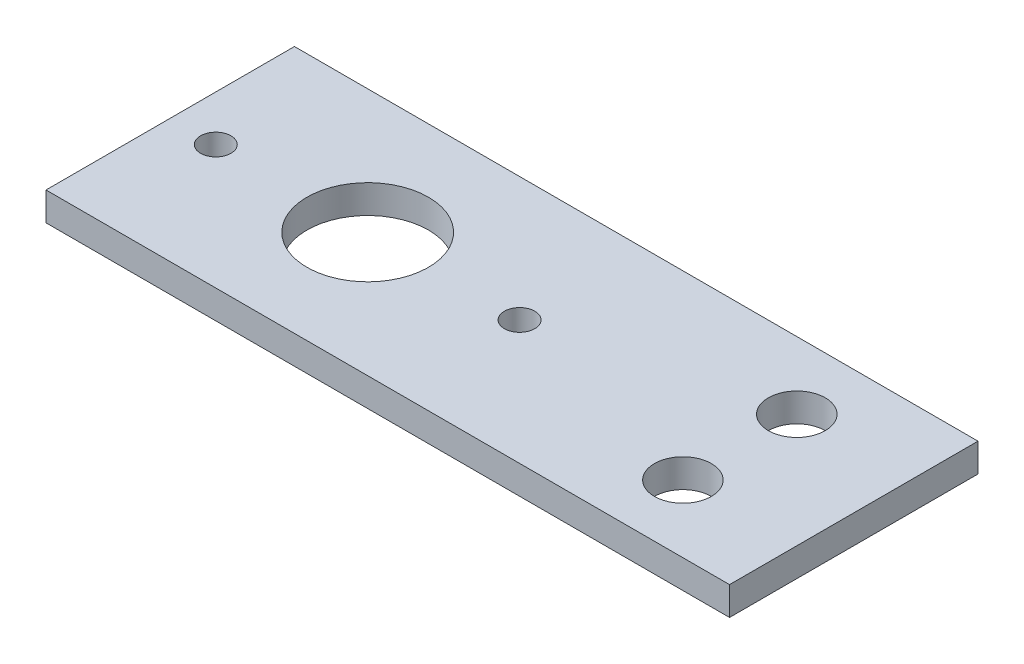
ISO-10303-21;
HEADER;
FILE_DESCRIPTION(('STEP AP214'),'2;1');
FILE_NAME('part.step','',(''),(''),'','','');
FILE_SCHEMA(('AUTOMOTIVE_DESIGN { 1 0 10303 214 1 1 1 1 }'));
ENDSEC;
DATA;
#1=APPLICATION_CONTEXT('core data for automotive mechanical design processes');
#2=APPLICATION_PROTOCOL_DEFINITION('international standard','automotive_design',2000,#1);
#3=PRODUCT_CONTEXT('',#1,'mechanical');
#4=PRODUCT('Part','Part','',(#3));
#5=PRODUCT_RELATED_PRODUCT_CATEGORY('part','',(#4));
#6=PRODUCT_DEFINITION_FORMATION('','',#4);
#7=PRODUCT_DEFINITION_CONTEXT('part definition',#1,'design');
#8=PRODUCT_DEFINITION('design','',#6,#7);
#9=PRODUCT_DEFINITION_SHAPE('','',#8);
#10=(LENGTH_UNIT() NAMED_UNIT(*) SI_UNIT(.MILLI.,.METRE.));
#11=(NAMED_UNIT(*) PLANE_ANGLE_UNIT() SI_UNIT($,.RADIAN.));
#12=(NAMED_UNIT(*) SI_UNIT($,.STERADIAN.) SOLID_ANGLE_UNIT());
#13=UNCERTAINTY_MEASURE_WITH_UNIT(LENGTH_MEASURE(1.E-05),#10,'distance_accuracy_value','');
#14=(GEOMETRIC_REPRESENTATION_CONTEXT(3) GLOBAL_UNCERTAINTY_ASSIGNED_CONTEXT((#13)) GLOBAL_UNIT_ASSIGNED_CONTEXT((#10,
#11,#12)) REPRESENTATION_CONTEXT('',''));
#15=CARTESIAN_POINT('',(0.,0.,0.));
#16=DIRECTION('',(0.,0.,1.));
#17=DIRECTION('',(1.,0.,0.));
#18=AXIS2_PLACEMENT_3D('',#15,#16,#17);
#19=CARTESIAN_POINT('',(0.,4.7625,0.));
#20=DIRECTION('',(0.,-1.,0.));
#21=DIRECTION('',(0.,0.,-1.));
#22=AXIS2_PLACEMENT_3D('',#19,#20,#21);
#23=PLANE('',#22);
#24=DIRECTION('',(0.,0.,1.));
#25=VECTOR('',#24,1.);
#26=CARTESIAN_POINT('',(-114.3,4.7625,20.7739818260166));
#27=LINE('',#26,#25);
#28=CARTESIAN_POINT('',(-114.3,4.7625,-20.7739818260166));
#29=VERTEX_POINT('',#28);
#30=CARTESIAN_POINT('',(-114.3,4.7625,20.7739818260166));
#31=VERTEX_POINT('',#30);
#32=EDGE_CURVE('E96',#29,#31,#27,.T.);
#33=ORIENTED_EDGE('',*,*,#32,.T.);
#34=DIRECTION('',(1.,0.,0.));
#35=VECTOR('',#34,1.);
#36=CARTESIAN_POINT('',(-114.3,4.7625,20.7739818260166));
#37=LINE('',#36,#35);
#38=CARTESIAN_POINT('',(0.,4.7625,20.7739818260166));
#39=VERTEX_POINT('',#38);
#40=EDGE_CURVE('E91',#31,#39,#37,.T.);
#41=ORIENTED_EDGE('',*,*,#40,.T.);
#42=DIRECTION('',(0.,0.,-1.));
#43=VECTOR('',#42,1.);
#44=CARTESIAN_POINT('',(0.,4.7625,-20.7739818260166));
#45=LINE('',#44,#43);
#46=CARTESIAN_POINT('',(0.,4.7625,-20.7739818260166));
#47=VERTEX_POINT('',#46);
#48=EDGE_CURVE('E94',#39,#47,#45,.T.);
#49=ORIENTED_EDGE('',*,*,#48,.T.);
#50=DIRECTION('',(-1.,0.,0.));
#51=VECTOR('',#50,1.);
#52=CARTESIAN_POINT('',(-114.3,4.7625,-20.7739818260166));
#53=LINE('',#52,#51);
#54=EDGE_CURVE('E61',#47,#29,#53,.T.);
#55=ORIENTED_EDGE('',*,*,#54,.T.);
#56=EDGE_LOOP('',(#33,#41,#49,#55));
#57=FACE_BOUND('',#56,.T.);
#58=CARTESIAN_POINT('',(-106.68,4.7625,0.));
#59=DIRECTION('',(0.,1.,0.));
#60=DIRECTION('',(0.,0.,1.));
#61=AXIS2_PLACEMENT_3D('',#58,#59,#60);
#62=CIRCLE('',#61,2.53999999999998);
#63=CARTESIAN_POINT('',(-106.68,4.7625,-2.53999999999998));
#64=VERTEX_POINT('',#63);
#65=EDGE_CURVE('E116',#64,#64,#62,.T.);
#66=ORIENTED_EDGE('',*,*,#65,.F.);
#67=EDGE_LOOP('',(#66));
#68=FACE_BOUND('',#67,.T.);
#69=CARTESIAN_POINT('',(-81.28,4.7625,0.));
#70=DIRECTION('',(0.,1.,0.));
#71=DIRECTION('',(0.,0.,1.));
#72=AXIS2_PLACEMENT_3D('',#69,#70,#71);
#73=CIRCLE('',#72,10.16);
#74=CARTESIAN_POINT('',(-81.28,4.7625,-10.16));
#75=VERTEX_POINT('',#74);
#76=EDGE_CURVE('E138',#75,#75,#73,.T.);
#77=ORIENTED_EDGE('',*,*,#76,.F.);
#78=EDGE_LOOP('',(#77));
#79=FACE_BOUND('',#78,.T.);
#80=CARTESIAN_POINT('',(-55.88,4.7625,0.));
#81=DIRECTION('',(0.,1.,0.));
#82=DIRECTION('',(0.,0.,1.));
#83=AXIS2_PLACEMENT_3D('',#80,#81,#82);
#84=CIRCLE('',#83,2.53999999999998);
#85=CARTESIAN_POINT('',(-55.88,4.7625,-2.53999999999998));
#86=VERTEX_POINT('',#85);
#87=EDGE_CURVE('E146',#86,#86,#84,.T.);
#88=ORIENTED_EDGE('',*,*,#87,.F.);
#89=EDGE_LOOP('',(#88));
#90=FACE_BOUND('',#89,.T.);
#91=CARTESIAN_POINT('',(-19.05,4.7625,-9.525));
#92=DIRECTION('',(0.,1.,0.));
#93=DIRECTION('',(0.,0.,1.));
#94=AXIS2_PLACEMENT_3D('',#91,#92,#93);
#95=CIRCLE('',#94,4.7625);
#96=CARTESIAN_POINT('',(-19.05,4.7625,-14.2875));
#97=VERTEX_POINT('',#96);
#98=EDGE_CURVE('E154',#97,#97,#95,.T.);
#99=ORIENTED_EDGE('',*,*,#98,.F.);
#100=EDGE_LOOP('',(#99));
#101=FACE_BOUND('',#100,.T.);
#102=CARTESIAN_POINT('',(-19.05,4.7625,9.525));
#103=DIRECTION('',(0.,1.,0.));
#104=DIRECTION('',(0.,0.,-1.));
#105=AXIS2_PLACEMENT_3D('',#102,#103,#104);
#106=CIRCLE('',#105,4.7625);
#107=CARTESIAN_POINT('',(-19.05,4.7625,4.7625));
#108=VERTEX_POINT('',#107);
#109=EDGE_CURVE('E162',#108,#108,#106,.T.);
#110=ORIENTED_EDGE('',*,*,#109,.F.);
#111=EDGE_LOOP('',(#110));
#112=FACE_BOUND('',#111,.T.);
#113=ADVANCED_FACE('F43',(#57,#68,#79,#90,#101,#112),#23,.F.);
#114=CARTESIAN_POINT('',(0.,0.,0.));
#115=DIRECTION('',(0.,-1.,0.));
#116=DIRECTION('',(0.,0.,-1.));
#117=AXIS2_PLACEMENT_3D('',#114,#115,#116);
#118=PLANE('',#117);
#119=CARTESIAN_POINT('',(-19.05,0.,-9.525));
#120=DIRECTION('',(0.,1.,0.));
#121=DIRECTION('',(0.,0.,1.));
#122=AXIS2_PLACEMENT_3D('',#119,#120,#121);
#123=CIRCLE('',#122,4.7625);
#124=CARTESIAN_POINT('',(-19.05,0.,-14.2875));
#125=VERTEX_POINT('',#124);
#126=EDGE_CURVE('E158',#125,#125,#123,.T.);
#127=ORIENTED_EDGE('',*,*,#126,.T.);
#128=EDGE_LOOP('',(#127));
#129=FACE_BOUND('',#128,.T.);
#130=CARTESIAN_POINT('',(-81.28,0.,0.));
#131=DIRECTION('',(0.,1.,0.));
#132=DIRECTION('',(0.,0.,1.));
#133=AXIS2_PLACEMENT_3D('',#130,#131,#132);
#134=CIRCLE('',#133,10.16);
#135=CARTESIAN_POINT('',(-81.28,0.,-10.16));
#136=VERTEX_POINT('',#135);
#137=EDGE_CURVE('E142',#136,#136,#134,.T.);
#138=ORIENTED_EDGE('',*,*,#137,.T.);
#139=EDGE_LOOP('',(#138));
#140=FACE_BOUND('',#139,.T.);
#141=DIRECTION('',(0.,0.,1.));
#142=VECTOR('',#141,1.);
#143=CARTESIAN_POINT('',(-114.3,0.,20.7739818260166));
#144=LINE('',#143,#142);
#145=CARTESIAN_POINT('',(-114.3,0.,-20.7739818260166));
#146=VERTEX_POINT('',#145);
#147=CARTESIAN_POINT('',(-114.3,0.,20.7739818260166));
#148=VERTEX_POINT('',#147);
#149=EDGE_CURVE('E112',#146,#148,#144,.T.);
#150=ORIENTED_EDGE('',*,*,#149,.F.);
#151=DIRECTION('',(-1.,0.,0.));
#152=VECTOR('',#151,1.);
#153=CARTESIAN_POINT('',(-114.3,0.,-20.7739818260166));
#154=LINE('',#153,#152);
#155=CARTESIAN_POINT('',(0.,0.,-20.7739818260166));
#156=VERTEX_POINT('',#155);
#157=EDGE_CURVE('E84',#156,#146,#154,.T.);
#158=ORIENTED_EDGE('',*,*,#157,.F.);
#159=DIRECTION('',(0.,0.,-1.));
#160=VECTOR('',#159,1.);
#161=CARTESIAN_POINT('',(0.,0.,-20.7739818260166));
#162=LINE('',#161,#160);
#163=CARTESIAN_POINT('',(0.,0.,20.7739818260166));
#164=VERTEX_POINT('',#163);
#165=EDGE_CURVE('E78',#164,#156,#162,.T.);
#166=ORIENTED_EDGE('',*,*,#165,.F.);
#167=DIRECTION('',(1.,0.,0.));
#168=VECTOR('',#167,1.);
#169=CARTESIAN_POINT('',(-114.3,0.,20.7739818260166));
#170=LINE('',#169,#168);
#171=EDGE_CURVE('E101',#148,#164,#170,.T.);
#172=ORIENTED_EDGE('',*,*,#171,.F.);
#173=EDGE_LOOP('',(#150,#158,#166,#172));
#174=FACE_BOUND('',#173,.T.);
#175=CARTESIAN_POINT('',(-106.68,0.,0.));
#176=DIRECTION('',(0.,1.,0.));
#177=DIRECTION('',(0.,0.,1.));
#178=AXIS2_PLACEMENT_3D('',#175,#176,#177);
#179=CIRCLE('',#178,2.53999999999998);
#180=CARTESIAN_POINT('',(-106.68,0.,-2.53999999999998));
#181=VERTEX_POINT('',#180);
#182=EDGE_CURVE('E134',#181,#181,#179,.T.);
#183=ORIENTED_EDGE('',*,*,#182,.T.);
#184=EDGE_LOOP('',(#183));
#185=FACE_BOUND('',#184,.T.);
#186=CARTESIAN_POINT('',(-55.88,0.,0.));
#187=DIRECTION('',(0.,1.,0.));
#188=DIRECTION('',(0.,0.,1.));
#189=AXIS2_PLACEMENT_3D('',#186,#187,#188);
#190=CIRCLE('',#189,2.53999999999998);
#191=CARTESIAN_POINT('',(-55.88,0.,-2.53999999999998));
#192=VERTEX_POINT('',#191);
#193=EDGE_CURVE('E150',#192,#192,#190,.T.);
#194=ORIENTED_EDGE('',*,*,#193,.T.);
#195=EDGE_LOOP('',(#194));
#196=FACE_BOUND('',#195,.T.);
#197=CARTESIAN_POINT('',(-19.05,0.,9.525));
#198=DIRECTION('',(0.,1.,0.));
#199=DIRECTION('',(0.,0.,-1.));
#200=AXIS2_PLACEMENT_3D('',#197,#198,#199);
#201=CIRCLE('',#200,4.7625);
#202=CARTESIAN_POINT('',(-19.05,0.,4.7625));
#203=VERTEX_POINT('',#202);
#204=EDGE_CURVE('E166',#203,#203,#201,.T.);
#205=ORIENTED_EDGE('',*,*,#204,.T.);
#206=EDGE_LOOP('',(#205));
#207=FACE_BOUND('',#206,.T.);
#208=ADVANCED_FACE('F129',(#129,#140,#174,#185,#196,#207),#118,.T.);
#209=CARTESIAN_POINT('',(-114.3,4.7625,20.7739818260166));
#210=DIRECTION('',(1.,0.,0.));
#211=DIRECTION('',(0.,0.,-1.));
#212=AXIS2_PLACEMENT_3D('',#209,#210,#211);
#213=PLANE('',#212);
#214=ORIENTED_EDGE('',*,*,#149,.T.);
#215=DIRECTION('',(0.,-1.,0.));
#216=VECTOR('',#215,1.);
#217=CARTESIAN_POINT('',(-114.3,4.7625,20.7739818260166));
#218=LINE('',#217,#216);
#219=EDGE_CURVE('E11',#31,#148,#218,.T.);
#220=ORIENTED_EDGE('',*,*,#219,.F.);
#221=ORIENTED_EDGE('',*,*,#32,.F.);
#222=DIRECTION('',(0.,-1.,0.));
#223=VECTOR('',#222,1.);
#224=CARTESIAN_POINT('',(-114.3,4.7625,-20.7739818260166));
#225=LINE('',#224,#223);
#226=EDGE_CURVE('E108',#29,#146,#225,.T.);
#227=ORIENTED_EDGE('',*,*,#226,.T.);
#228=EDGE_LOOP('',(#214,#220,#221,#227));
#229=FACE_BOUND('',#228,.T.);
#230=ADVANCED_FACE('F45',(#229),#213,.F.);
#231=CARTESIAN_POINT('',(-114.3,4.7625,20.7739818260166));
#232=DIRECTION('',(0.,0.,-1.));
#233=DIRECTION('',(-1.,0.,0.));
#234=AXIS2_PLACEMENT_3D('',#231,#232,#233);
#235=PLANE('',#234);
#236=ORIENTED_EDGE('',*,*,#171,.T.);
#237=DIRECTION('',(0.,-1.,0.));
#238=VECTOR('',#237,1.);
#239=CARTESIAN_POINT('',(0.,4.7625,20.7739818260166));
#240=LINE('',#239,#238);
#241=EDGE_CURVE('E53',#39,#164,#240,.T.);
#242=ORIENTED_EDGE('',*,*,#241,.F.);
#243=ORIENTED_EDGE('',*,*,#40,.F.);
#244=ORIENTED_EDGE('',*,*,#219,.T.);
#245=EDGE_LOOP('',(#236,#242,#243,#244));
#246=FACE_BOUND('',#245,.T.);
#247=ADVANCED_FACE('F100',(#246),#235,.F.);
#248=CARTESIAN_POINT('',(0.,4.7625,-20.7739818260166));
#249=DIRECTION('',(-1.,0.,0.));
#250=DIRECTION('',(0.,0.,1.));
#251=AXIS2_PLACEMENT_3D('',#248,#249,#250);
#252=PLANE('',#251);
#253=ORIENTED_EDGE('',*,*,#165,.T.);
#254=DIRECTION('',(0.,-1.,0.));
#255=VECTOR('',#254,1.);
#256=CARTESIAN_POINT('',(0.,4.7625,-20.7739818260166));
#257=LINE('',#256,#255);
#258=EDGE_CURVE('E103',#47,#156,#257,.T.);
#259=ORIENTED_EDGE('',*,*,#258,.F.);
#260=ORIENTED_EDGE('',*,*,#48,.F.);
#261=ORIENTED_EDGE('',*,*,#241,.T.);
#262=EDGE_LOOP('',(#253,#259,#260,#261));
#263=FACE_BOUND('',#262,.T.);
#264=ADVANCED_FACE('F104',(#263),#252,.F.);
#265=CARTESIAN_POINT('',(-114.3,4.7625,-20.7739818260166));
#266=DIRECTION('',(0.,0.,1.));
#267=DIRECTION('',(1.,0.,0.));
#268=AXIS2_PLACEMENT_3D('',#265,#266,#267);
#269=PLANE('',#268);
#270=ORIENTED_EDGE('',*,*,#157,.T.);
#271=ORIENTED_EDGE('',*,*,#226,.F.);
#272=ORIENTED_EDGE('',*,*,#54,.F.);
#273=ORIENTED_EDGE('',*,*,#258,.T.);
#274=EDGE_LOOP('',(#270,#271,#272,#273));
#275=FACE_BOUND('',#274,.T.);
#276=ADVANCED_FACE('F126',(#275),#269,.F.);
#277=CARTESIAN_POINT('',(-106.68,4.7625,0.));
#278=DIRECTION('',(0.,-1.,0.));
#279=DIRECTION('',(0.,0.,-1.));
#280=AXIS2_PLACEMENT_3D('',#277,#278,#279);
#281=CYLINDRICAL_SURFACE('',#280,2.53999999999998);
#282=CARTESIAN_POINT('',(-106.68,4.7625,-2.53999999999998));
#283=CARTESIAN_POINT('',(-106.68,4.712890625,-2.53999999999998));
#284=CARTESIAN_POINT('',(-106.68,4.66328125,-2.53999999999998));
#285=CARTESIAN_POINT('',(-106.68,4.5640625,-2.53999999999998));
#286=CARTESIAN_POINT('',(-106.68,4.514453125,-2.53999999999998));
#287=CARTESIAN_POINT('',(-106.68,4.415234375,-2.53999999999998));
#288=CARTESIAN_POINT('',(-106.68,4.365625,-2.53999999999998));
#289=CARTESIAN_POINT('',(-106.68,4.26640625,-2.53999999999998));
#290=CARTESIAN_POINT('',(-106.68,4.216796875,-2.53999999999998));
#291=CARTESIAN_POINT('',(-106.68,4.117578125,-2.53999999999998));
#292=CARTESIAN_POINT('',(-106.68,4.06796875,-2.53999999999998));
#293=CARTESIAN_POINT('',(-106.68,3.96875,-2.53999999999998));
#294=CARTESIAN_POINT('',(-106.68,3.919140625,-2.53999999999998));
#295=CARTESIAN_POINT('',(-106.68,3.819921875,-2.53999999999998));
#296=CARTESIAN_POINT('',(-106.68,3.7703125,-2.53999999999998));
#297=CARTESIAN_POINT('',(-106.68,3.67109375,-2.53999999999998));
#298=CARTESIAN_POINT('',(-106.68,3.621484375,-2.53999999999998));
#299=CARTESIAN_POINT('',(-106.68,3.522265625,-2.53999999999998));
#300=CARTESIAN_POINT('',(-106.68,3.47265625,-2.53999999999998));
#301=CARTESIAN_POINT('',(-106.68,3.3734375,-2.53999999999998));
#302=CARTESIAN_POINT('',(-106.68,3.323828125,-2.53999999999998));
#303=CARTESIAN_POINT('',(-106.68,3.224609375,-2.53999999999998));
#304=CARTESIAN_POINT('',(-106.68,3.175,-2.53999999999998));
#305=CARTESIAN_POINT('',(-106.68,3.07578125,-2.53999999999998));
#306=CARTESIAN_POINT('',(-106.68,3.026171875,-2.53999999999998));
#307=CARTESIAN_POINT('',(-106.68,2.926953125,-2.53999999999998));
#308=CARTESIAN_POINT('',(-106.68,2.87734375,-2.53999999999998));
#309=CARTESIAN_POINT('',(-106.68,2.778125,-2.53999999999998));
#310=CARTESIAN_POINT('',(-106.68,2.728515625,-2.53999999999998));
#311=CARTESIAN_POINT('',(-106.68,2.629296875,-2.53999999999998));
#312=CARTESIAN_POINT('',(-106.68,2.5796875,-2.53999999999998));
#313=CARTESIAN_POINT('',(-106.68,2.48046875,-2.53999999999998));
#314=CARTESIAN_POINT('',(-106.68,2.430859375,-2.53999999999998));
#315=CARTESIAN_POINT('',(-106.68,2.331640625,-2.53999999999998));
#316=CARTESIAN_POINT('',(-106.68,2.28203125,-2.53999999999998));
#317=CARTESIAN_POINT('',(-106.68,2.1828125,-2.53999999999998));
#318=CARTESIAN_POINT('',(-106.68,2.133203125,-2.53999999999998));
#319=CARTESIAN_POINT('',(-106.68,2.033984375,-2.53999999999998));
#320=CARTESIAN_POINT('',(-106.68,1.984375,-2.53999999999998));
#321=CARTESIAN_POINT('',(-106.68,1.88515625,-2.53999999999998));
#322=CARTESIAN_POINT('',(-106.68,1.835546875,-2.53999999999998));
#323=CARTESIAN_POINT('',(-106.68,1.736328125,-2.53999999999998));
#324=CARTESIAN_POINT('',(-106.68,1.68671875,-2.53999999999998));
#325=CARTESIAN_POINT('',(-106.68,1.5875,-2.53999999999998));
#326=CARTESIAN_POINT('',(-106.68,1.537890625,-2.53999999999998));
#327=CARTESIAN_POINT('',(-106.68,1.438671875,-2.53999999999998));
#328=CARTESIAN_POINT('',(-106.68,1.3890625,-2.53999999999998));
#329=CARTESIAN_POINT('',(-106.68,1.28984375,-2.53999999999998));
#330=CARTESIAN_POINT('',(-106.68,1.240234375,-2.53999999999998));
#331=CARTESIAN_POINT('',(-106.68,1.141015625,-2.53999999999998));
#332=CARTESIAN_POINT('',(-106.68,1.09140625,-2.53999999999998));
#333=CARTESIAN_POINT('',(-106.68,0.992187499999999,-2.53999999999998));
#334=CARTESIAN_POINT('',(-106.68,0.942578124999999,-2.53999999999998));
#335=CARTESIAN_POINT('',(-106.68,0.843359375,-2.53999999999998));
#336=CARTESIAN_POINT('',(-106.68,0.79375,-2.53999999999998));
#337=CARTESIAN_POINT('',(-106.68,0.69453125,-2.53999999999998));
#338=CARTESIAN_POINT('',(-106.68,0.644921875,-2.53999999999998));
#339=CARTESIAN_POINT('',(-106.68,0.545703125,-2.53999999999998));
#340=CARTESIAN_POINT('',(-106.68,0.49609375,-2.53999999999998));
#341=CARTESIAN_POINT('',(-106.68,0.396875,-2.53999999999998));
#342=CARTESIAN_POINT('',(-106.68,0.347265625,-2.53999999999998));
#343=CARTESIAN_POINT('',(-106.68,0.248046875,-2.53999999999998));
#344=CARTESIAN_POINT('',(-106.68,0.1984375,-2.53999999999998));
#345=CARTESIAN_POINT('',(-106.68,0.09921875,-2.53999999999998));
#346=CARTESIAN_POINT('',(-106.68,0.049609375,-2.53999999999998));
#347=CARTESIAN_POINT('',(-106.68,0.,-2.53999999999998));
#348=B_SPLINE_CURVE_WITH_KNOTS('',3,(#282,#283,#284,#285,#286,#287,#288,#289,#290,#291,#292,
#293,#294,#295,#296,#297,#298,#299,#300,#301,#302,#303,#304,#305,#306,#307,#308,#309,#310,#311,
#312,#313,#314,#315,#316,#317,#318,#319,#320,#321,#322,#323,#324,#325,#326,#327,#328,#329,#330,
#331,#332,#333,#334,#335,#336,#337,#338,#339,#340,#341,#342,#343,#344,#345,#346,#347),
.UNSPECIFIED.,.F.,.F.,(4,2,2,2,2,2,2,2,2,2,2,2,2,2,2,2,2,2,2,2,2,2,2,2,2,2,2,2,2,2,2,2,4),(0.,
0.148828125,0.29765625,0.446484375,0.5953125,0.744140625,0.892968750000001,1.041796875,1.190625,
1.339453125,1.48828125,1.637109375,1.7859375,1.934765625,2.08359375,2.232421875,2.38125,
2.530078125,2.67890625,2.827734375,2.9765625,3.125390625,3.27421875,3.423046875,3.571875,
3.720703125,3.86953125,4.018359375,4.1671875,4.316015625,4.46484375,4.613671875,4.7625),.UNSPECIFIED.);
#349=EDGE_CURVE('BSEAM185',#64,#181,#348,.T.);
#350=ORIENTED_EDGE('',*,*,#65,.T.);
#351=ORIENTED_EDGE('',*,*,#182,.F.);
#352=ORIENTED_EDGE('',*,*,#349,.T.);
#353=ORIENTED_EDGE('',*,*,#349,.F.);
#354=EDGE_LOOP('',(#350,#352,#351,#353));
#355=FACE_BOUND('',#354,.T.);
#356=ADVANCED_FACE('F185',(#355),#281,.F.);
#357=CARTESIAN_POINT('',(-81.28,4.7625,0.));
#358=DIRECTION('',(0.,-1.,0.));
#359=DIRECTION('',(0.,0.,-1.));
#360=AXIS2_PLACEMENT_3D('',#357,#358,#359);
#361=CYLINDRICAL_SURFACE('',#360,10.16);
#362=CARTESIAN_POINT('',(-81.28,4.7625,-10.16));
#363=CARTESIAN_POINT('',(-81.28,4.712890625,-10.16));
#364=CARTESIAN_POINT('',(-81.28,4.66328125,-10.16));
#365=CARTESIAN_POINT('',(-81.28,4.5640625,-10.16));
#366=CARTESIAN_POINT('',(-81.28,4.514453125,-10.16));
#367=CARTESIAN_POINT('',(-81.28,4.415234375,-10.16));
#368=CARTESIAN_POINT('',(-81.28,4.365625,-10.16));
#369=CARTESIAN_POINT('',(-81.28,4.26640625,-10.16));
#370=CARTESIAN_POINT('',(-81.28,4.216796875,-10.16));
#371=CARTESIAN_POINT('',(-81.28,4.117578125,-10.16));
#372=CARTESIAN_POINT('',(-81.28,4.06796875,-10.16));
#373=CARTESIAN_POINT('',(-81.28,3.96875,-10.16));
#374=CARTESIAN_POINT('',(-81.28,3.919140625,-10.16));
#375=CARTESIAN_POINT('',(-81.28,3.819921875,-10.16));
#376=CARTESIAN_POINT('',(-81.28,3.7703125,-10.16));
#377=CARTESIAN_POINT('',(-81.28,3.67109375,-10.16));
#378=CARTESIAN_POINT('',(-81.28,3.621484375,-10.16));
#379=CARTESIAN_POINT('',(-81.28,3.522265625,-10.16));
#380=CARTESIAN_POINT('',(-81.28,3.47265625,-10.16));
#381=CARTESIAN_POINT('',(-81.28,3.3734375,-10.16));
#382=CARTESIAN_POINT('',(-81.28,3.323828125,-10.16));
#383=CARTESIAN_POINT('',(-81.28,3.224609375,-10.16));
#384=CARTESIAN_POINT('',(-81.28,3.175,-10.16));
#385=CARTESIAN_POINT('',(-81.28,3.07578125,-10.16));
#386=CARTESIAN_POINT('',(-81.28,3.026171875,-10.16));
#387=CARTESIAN_POINT('',(-81.28,2.926953125,-10.16));
#388=CARTESIAN_POINT('',(-81.28,2.87734375,-10.16));
#389=CARTESIAN_POINT('',(-81.28,2.778125,-10.16));
#390=CARTESIAN_POINT('',(-81.28,2.728515625,-10.16));
#391=CARTESIAN_POINT('',(-81.28,2.629296875,-10.16));
#392=CARTESIAN_POINT('',(-81.28,2.5796875,-10.16));
#393=CARTESIAN_POINT('',(-81.28,2.48046875,-10.16));
#394=CARTESIAN_POINT('',(-81.28,2.430859375,-10.16));
#395=CARTESIAN_POINT('',(-81.28,2.331640625,-10.16));
#396=CARTESIAN_POINT('',(-81.28,2.28203125,-10.16));
#397=CARTESIAN_POINT('',(-81.28,2.1828125,-10.16));
#398=CARTESIAN_POINT('',(-81.28,2.133203125,-10.16));
#399=CARTESIAN_POINT('',(-81.28,2.033984375,-10.16));
#400=CARTESIAN_POINT('',(-81.28,1.984375,-10.16));
#401=CARTESIAN_POINT('',(-81.28,1.88515625,-10.16));
#402=CARTESIAN_POINT('',(-81.28,1.835546875,-10.16));
#403=CARTESIAN_POINT('',(-81.28,1.736328125,-10.16));
#404=CARTESIAN_POINT('',(-81.28,1.68671875,-10.16));
#405=CARTESIAN_POINT('',(-81.28,1.5875,-10.16));
#406=CARTESIAN_POINT('',(-81.28,1.537890625,-10.16));
#407=CARTESIAN_POINT('',(-81.28,1.438671875,-10.16));
#408=CARTESIAN_POINT('',(-81.28,1.3890625,-10.16));
#409=CARTESIAN_POINT('',(-81.28,1.28984375,-10.16));
#410=CARTESIAN_POINT('',(-81.28,1.240234375,-10.16));
#411=CARTESIAN_POINT('',(-81.28,1.141015625,-10.16));
#412=CARTESIAN_POINT('',(-81.28,1.09140625,-10.16));
#413=CARTESIAN_POINT('',(-81.28,0.9921875,-10.16));
#414=CARTESIAN_POINT('',(-81.28,0.942578125,-10.16));
#415=CARTESIAN_POINT('',(-81.28,0.843359375,-10.16));
#416=CARTESIAN_POINT('',(-81.28,0.79375,-10.16));
#417=CARTESIAN_POINT('',(-81.28,0.69453125,-10.16));
#418=CARTESIAN_POINT('',(-81.28,0.644921875,-10.16));
#419=CARTESIAN_POINT('',(-81.28,0.545703125,-10.16));
#420=CARTESIAN_POINT('',(-81.28,0.49609375,-10.16));
#421=CARTESIAN_POINT('',(-81.28,0.396875,-10.16));
#422=CARTESIAN_POINT('',(-81.28,0.347265625,-10.16));
#423=CARTESIAN_POINT('',(-81.28,0.248046875,-10.16));
#424=CARTESIAN_POINT('',(-81.28,0.1984375,-10.16));
#425=CARTESIAN_POINT('',(-81.28,0.09921875,-10.16));
#426=CARTESIAN_POINT('',(-81.28,0.049609375,-10.16));
#427=CARTESIAN_POINT('',(-81.28,0.,-10.16));
#428=B_SPLINE_CURVE_WITH_KNOTS('',3,(#362,#363,#364,#365,#366,#367,#368,#369,#370,#371,#372,
#373,#374,#375,#376,#377,#378,#379,#380,#381,#382,#383,#384,#385,#386,#387,#388,#389,#390,#391,
#392,#393,#394,#395,#396,#397,#398,#399,#400,#401,#402,#403,#404,#405,#406,#407,#408,#409,#410,
#411,#412,#413,#414,#415,#416,#417,#418,#419,#420,#421,#422,#423,#424,#425,#426,#427),
.UNSPECIFIED.,.F.,.F.,(4,2,2,2,2,2,2,2,2,2,2,2,2,2,2,2,2,2,2,2,2,2,2,2,2,2,2,2,2,2,2,2,4),(0.,
0.148828124999999,0.297656249999999,0.446484374999999,0.595312499999999,0.744140625,0.89296875,
1.041796875,1.190625,1.339453125,1.48828125,1.637109375,1.7859375,1.934765625,2.08359375,
2.232421875,2.38125,2.530078125,2.67890625,2.827734375,2.9765625,3.125390625,3.27421875,
3.423046875,3.571875,3.720703125,3.86953125,4.018359375,4.1671875,4.316015625,4.46484375,
4.613671875,4.7625),.UNSPECIFIED.);
#429=EDGE_CURVE('BSEAM239',#75,#136,#428,.T.);
#430=ORIENTED_EDGE('',*,*,#76,.T.);
#431=ORIENTED_EDGE('',*,*,#137,.F.);
#432=ORIENTED_EDGE('',*,*,#429,.T.);
#433=ORIENTED_EDGE('',*,*,#429,.F.);
#434=EDGE_LOOP('',(#430,#432,#431,#433));
#435=FACE_BOUND('',#434,.T.);
#436=ADVANCED_FACE('F239',(#435),#361,.F.);
#437=CARTESIAN_POINT('',(-55.88,4.7625,0.));
#438=DIRECTION('',(0.,-1.,0.));
#439=DIRECTION('',(0.,0.,-1.));
#440=AXIS2_PLACEMENT_3D('',#437,#438,#439);
#441=CYLINDRICAL_SURFACE('',#440,2.53999999999998);
#442=CARTESIAN_POINT('',(-55.88,4.7625,-2.53999999999998));
#443=CARTESIAN_POINT('',(-55.88,4.712890625,-2.53999999999998));
#444=CARTESIAN_POINT('',(-55.88,4.66328125,-2.53999999999998));
#445=CARTESIAN_POINT('',(-55.88,4.5640625,-2.53999999999998));
#446=CARTESIAN_POINT('',(-55.88,4.514453125,-2.53999999999998));
#447=CARTESIAN_POINT('',(-55.88,4.415234375,-2.53999999999998));
#448=CARTESIAN_POINT('',(-55.88,4.365625,-2.53999999999998));
#449=CARTESIAN_POINT('',(-55.88,4.26640625,-2.53999999999998));
#450=CARTESIAN_POINT('',(-55.88,4.216796875,-2.53999999999998));
#451=CARTESIAN_POINT('',(-55.88,4.117578125,-2.53999999999998));
#452=CARTESIAN_POINT('',(-55.88,4.06796875,-2.53999999999998));
#453=CARTESIAN_POINT('',(-55.88,3.96875,-2.53999999999998));
#454=CARTESIAN_POINT('',(-55.88,3.919140625,-2.53999999999998));
#455=CARTESIAN_POINT('',(-55.88,3.819921875,-2.53999999999998));
#456=CARTESIAN_POINT('',(-55.88,3.7703125,-2.53999999999998));
#457=CARTESIAN_POINT('',(-55.88,3.67109375,-2.53999999999998));
#458=CARTESIAN_POINT('',(-55.88,3.621484375,-2.53999999999998));
#459=CARTESIAN_POINT('',(-55.88,3.522265625,-2.53999999999998));
#460=CARTESIAN_POINT('',(-55.88,3.47265625,-2.53999999999998));
#461=CARTESIAN_POINT('',(-55.88,3.3734375,-2.53999999999998));
#462=CARTESIAN_POINT('',(-55.88,3.323828125,-2.53999999999998));
#463=CARTESIAN_POINT('',(-55.88,3.224609375,-2.53999999999998));
#464=CARTESIAN_POINT('',(-55.88,3.175,-2.53999999999998));
#465=CARTESIAN_POINT('',(-55.88,3.07578125,-2.53999999999998));
#466=CARTESIAN_POINT('',(-55.88,3.026171875,-2.53999999999998));
#467=CARTESIAN_POINT('',(-55.88,2.926953125,-2.53999999999998));
#468=CARTESIAN_POINT('',(-55.88,2.87734375,-2.53999999999998));
#469=CARTESIAN_POINT('',(-55.88,2.778125,-2.53999999999998));
#470=CARTESIAN_POINT('',(-55.88,2.728515625,-2.53999999999998));
#471=CARTESIAN_POINT('',(-55.88,2.629296875,-2.53999999999998));
#472=CARTESIAN_POINT('',(-55.88,2.5796875,-2.53999999999998));
#473=CARTESIAN_POINT('',(-55.88,2.48046875,-2.53999999999998));
#474=CARTESIAN_POINT('',(-55.88,2.430859375,-2.53999999999998));
#475=CARTESIAN_POINT('',(-55.88,2.331640625,-2.53999999999998));
#476=CARTESIAN_POINT('',(-55.88,2.28203125,-2.53999999999998));
#477=CARTESIAN_POINT('',(-55.88,2.1828125,-2.53999999999998));
#478=CARTESIAN_POINT('',(-55.88,2.133203125,-2.53999999999998));
#479=CARTESIAN_POINT('',(-55.88,2.033984375,-2.53999999999998));
#480=CARTESIAN_POINT('',(-55.88,1.984375,-2.53999999999998));
#481=CARTESIAN_POINT('',(-55.88,1.88515625,-2.53999999999998));
#482=CARTESIAN_POINT('',(-55.88,1.835546875,-2.53999999999998));
#483=CARTESIAN_POINT('',(-55.88,1.736328125,-2.53999999999998));
#484=CARTESIAN_POINT('',(-55.88,1.68671875,-2.53999999999998));
#485=CARTESIAN_POINT('',(-55.88,1.5875,-2.53999999999998));
#486=CARTESIAN_POINT('',(-55.88,1.537890625,-2.53999999999998));
#487=CARTESIAN_POINT('',(-55.88,1.438671875,-2.53999999999998));
#488=CARTESIAN_POINT('',(-55.88,1.3890625,-2.53999999999998));
#489=CARTESIAN_POINT('',(-55.88,1.28984375,-2.53999999999998));
#490=CARTESIAN_POINT('',(-55.88,1.240234375,-2.53999999999998));
#491=CARTESIAN_POINT('',(-55.88,1.141015625,-2.53999999999998));
#492=CARTESIAN_POINT('',(-55.88,1.09140625,-2.53999999999998));
#493=CARTESIAN_POINT('',(-55.88,0.992187499999999,-2.53999999999998));
#494=CARTESIAN_POINT('',(-55.88,0.942578124999999,-2.53999999999998));
#495=CARTESIAN_POINT('',(-55.88,0.843359375,-2.53999999999998));
#496=CARTESIAN_POINT('',(-55.88,0.79375,-2.53999999999998));
#497=CARTESIAN_POINT('',(-55.88,0.69453125,-2.53999999999998));
#498=CARTESIAN_POINT('',(-55.88,0.644921875,-2.53999999999998));
#499=CARTESIAN_POINT('',(-55.88,0.545703125,-2.53999999999998));
#500=CARTESIAN_POINT('',(-55.88,0.49609375,-2.53999999999998));
#501=CARTESIAN_POINT('',(-55.88,0.396875,-2.53999999999998));
#502=CARTESIAN_POINT('',(-55.88,0.347265625,-2.53999999999998));
#503=CARTESIAN_POINT('',(-55.88,0.248046875,-2.53999999999998));
#504=CARTESIAN_POINT('',(-55.88,0.1984375,-2.53999999999998));
#505=CARTESIAN_POINT('',(-55.88,0.09921875,-2.53999999999998));
#506=CARTESIAN_POINT('',(-55.88,0.049609375,-2.53999999999998));
#507=CARTESIAN_POINT('',(-55.88,0.,-2.53999999999998));
#508=B_SPLINE_CURVE_WITH_KNOTS('',3,(#442,#443,#444,#445,#446,#447,#448,#449,#450,#451,#452,
#453,#454,#455,#456,#457,#458,#459,#460,#461,#462,#463,#464,#465,#466,#467,#468,#469,#470,#471,
#472,#473,#474,#475,#476,#477,#478,#479,#480,#481,#482,#483,#484,#485,#486,#487,#488,#489,#490,
#491,#492,#493,#494,#495,#496,#497,#498,#499,#500,#501,#502,#503,#504,#505,#506,#507),
.UNSPECIFIED.,.F.,.F.,(4,2,2,2,2,2,2,2,2,2,2,2,2,2,2,2,2,2,2,2,2,2,2,2,2,2,2,2,2,2,2,2,4),(0.,
0.148828125,0.29765625,0.446484375,0.5953125,0.744140625,0.892968750000001,1.041796875,1.190625,
1.339453125,1.48828125,1.637109375,1.7859375,1.934765625,2.08359375,2.232421875,2.38125,
2.530078125,2.67890625,2.827734375,2.9765625,3.125390625,3.27421875,3.423046875,3.571875,
3.720703125,3.86953125,4.018359375,4.1671875,4.316015625,4.46484375,4.613671875,4.7625),.UNSPECIFIED.);
#509=EDGE_CURVE('BSEAM248',#86,#192,#508,.T.);
#510=ORIENTED_EDGE('',*,*,#87,.T.);
#511=ORIENTED_EDGE('',*,*,#193,.F.);
#512=ORIENTED_EDGE('',*,*,#509,.T.);
#513=ORIENTED_EDGE('',*,*,#509,.F.);
#514=EDGE_LOOP('',(#510,#512,#511,#513));
#515=FACE_BOUND('',#514,.T.);
#516=ADVANCED_FACE('F248',(#515),#441,.F.);
#517=CARTESIAN_POINT('',(-19.05,4.7625,-9.525));
#518=DIRECTION('',(0.,-1.,0.));
#519=DIRECTION('',(0.,0.,-1.));
#520=AXIS2_PLACEMENT_3D('',#517,#518,#519);
#521=CYLINDRICAL_SURFACE('',#520,4.7625);
#522=CARTESIAN_POINT('',(-19.05,4.7625,-14.2875));
#523=CARTESIAN_POINT('',(-19.05,4.712890625,-14.2875));
#524=CARTESIAN_POINT('',(-19.05,4.66328125,-14.2875));
#525=CARTESIAN_POINT('',(-19.05,4.5640625,-14.2875));
#526=CARTESIAN_POINT('',(-19.05,4.514453125,-14.2875));
#527=CARTESIAN_POINT('',(-19.05,4.415234375,-14.2875));
#528=CARTESIAN_POINT('',(-19.05,4.365625,-14.2875));
#529=CARTESIAN_POINT('',(-19.05,4.26640625,-14.2875));
#530=CARTESIAN_POINT('',(-19.05,4.216796875,-14.2875));
#531=CARTESIAN_POINT('',(-19.05,4.117578125,-14.2875));
#532=CARTESIAN_POINT('',(-19.05,4.06796875,-14.2875));
#533=CARTESIAN_POINT('',(-19.05,3.96875,-14.2875));
#534=CARTESIAN_POINT('',(-19.05,3.919140625,-14.2875));
#535=CARTESIAN_POINT('',(-19.05,3.819921875,-14.2875));
#536=CARTESIAN_POINT('',(-19.05,3.7703125,-14.2875));
#537=CARTESIAN_POINT('',(-19.05,3.67109375,-14.2875));
#538=CARTESIAN_POINT('',(-19.05,3.621484375,-14.2875));
#539=CARTESIAN_POINT('',(-19.05,3.522265625,-14.2875));
#540=CARTESIAN_POINT('',(-19.05,3.47265625,-14.2875));
#541=CARTESIAN_POINT('',(-19.05,3.3734375,-14.2875));
#542=CARTESIAN_POINT('',(-19.05,3.323828125,-14.2875));
#543=CARTESIAN_POINT('',(-19.05,3.224609375,-14.2875));
#544=CARTESIAN_POINT('',(-19.05,3.175,-14.2875));
#545=CARTESIAN_POINT('',(-19.05,3.07578125,-14.2875));
#546=CARTESIAN_POINT('',(-19.05,3.026171875,-14.2875));
#547=CARTESIAN_POINT('',(-19.05,2.926953125,-14.2875));
#548=CARTESIAN_POINT('',(-19.05,2.87734375,-14.2875));
#549=CARTESIAN_POINT('',(-19.05,2.778125,-14.2875));
#550=CARTESIAN_POINT('',(-19.05,2.728515625,-14.2875));
#551=CARTESIAN_POINT('',(-19.05,2.629296875,-14.2875));
#552=CARTESIAN_POINT('',(-19.05,2.5796875,-14.2875));
#553=CARTESIAN_POINT('',(-19.05,2.48046875,-14.2875));
#554=CARTESIAN_POINT('',(-19.05,2.430859375,-14.2875));
#555=CARTESIAN_POINT('',(-19.05,2.331640625,-14.2875));
#556=CARTESIAN_POINT('',(-19.05,2.28203125,-14.2875));
#557=CARTESIAN_POINT('',(-19.05,2.1828125,-14.2875));
#558=CARTESIAN_POINT('',(-19.05,2.133203125,-14.2875));
#559=CARTESIAN_POINT('',(-19.05,2.033984375,-14.2875));
#560=CARTESIAN_POINT('',(-19.05,1.984375,-14.2875));
#561=CARTESIAN_POINT('',(-19.05,1.88515625,-14.2875));
#562=CARTESIAN_POINT('',(-19.05,1.835546875,-14.2875));
#563=CARTESIAN_POINT('',(-19.05,1.736328125,-14.2875));
#564=CARTESIAN_POINT('',(-19.05,1.68671875,-14.2875));
#565=CARTESIAN_POINT('',(-19.05,1.5875,-14.2875));
#566=CARTESIAN_POINT('',(-19.05,1.537890625,-14.2875));
#567=CARTESIAN_POINT('',(-19.05,1.438671875,-14.2875));
#568=CARTESIAN_POINT('',(-19.05,1.3890625,-14.2875));
#569=CARTESIAN_POINT('',(-19.05,1.28984375,-14.2875));
#570=CARTESIAN_POINT('',(-19.05,1.240234375,-14.2875));
#571=CARTESIAN_POINT('',(-19.05,1.141015625,-14.2875));
#572=CARTESIAN_POINT('',(-19.05,1.09140625,-14.2875));
#573=CARTESIAN_POINT('',(-19.05,0.992187499999999,-14.2875));
#574=CARTESIAN_POINT('',(-19.05,0.942578124999999,-14.2875));
#575=CARTESIAN_POINT('',(-19.05,0.843359375,-14.2875));
#576=CARTESIAN_POINT('',(-19.05,0.79375,-14.2875));
#577=CARTESIAN_POINT('',(-19.05,0.69453125,-14.2875));
#578=CARTESIAN_POINT('',(-19.05,0.644921875,-14.2875));
#579=CARTESIAN_POINT('',(-19.05,0.545703125,-14.2875));
#580=CARTESIAN_POINT('',(-19.05,0.49609375,-14.2875));
#581=CARTESIAN_POINT('',(-19.05,0.396875,-14.2875));
#582=CARTESIAN_POINT('',(-19.05,0.347265625,-14.2875));
#583=CARTESIAN_POINT('',(-19.05,0.248046875,-14.2875));
#584=CARTESIAN_POINT('',(-19.05,0.1984375,-14.2875));
#585=CARTESIAN_POINT('',(-19.05,0.09921875,-14.2875));
#586=CARTESIAN_POINT('',(-19.05,0.049609375,-14.2875));
#587=CARTESIAN_POINT('',(-19.05,0.,-14.2875));
#588=B_SPLINE_CURVE_WITH_KNOTS('',3,(#522,#523,#524,#525,#526,#527,#528,#529,#530,#531,#532,
#533,#534,#535,#536,#537,#538,#539,#540,#541,#542,#543,#544,#545,#546,#547,#548,#549,#550,#551,
#552,#553,#554,#555,#556,#557,#558,#559,#560,#561,#562,#563,#564,#565,#566,#567,#568,#569,#570,
#571,#572,#573,#574,#575,#576,#577,#578,#579,#580,#581,#582,#583,#584,#585,#586,#587),
.UNSPECIFIED.,.F.,.F.,(4,2,2,2,2,2,2,2,2,2,2,2,2,2,2,2,2,2,2,2,2,2,2,2,2,2,2,2,2,2,2,2,4),(0.,
0.148828125,0.29765625,0.446484375,0.5953125,0.744140625,0.892968750000001,1.041796875,1.190625,
1.339453125,1.48828125,1.637109375,1.7859375,1.934765625,2.08359375,2.232421875,2.38125,
2.530078125,2.67890625,2.827734375,2.9765625,3.125390625,3.27421875,3.423046875,3.571875,
3.720703125,3.86953125,4.018359375,4.1671875,4.316015625,4.46484375,4.613671875,4.7625),.UNSPECIFIED.);
#589=EDGE_CURVE('BSEAM257',#97,#125,#588,.T.);
#590=ORIENTED_EDGE('',*,*,#98,.T.);
#591=ORIENTED_EDGE('',*,*,#126,.F.);
#592=ORIENTED_EDGE('',*,*,#589,.T.);
#593=ORIENTED_EDGE('',*,*,#589,.F.);
#594=EDGE_LOOP('',(#590,#592,#591,#593));
#595=FACE_BOUND('',#594,.T.);
#596=ADVANCED_FACE('F257',(#595),#521,.F.);
#597=CARTESIAN_POINT('',(-19.05,4.7625,9.525));
#598=DIRECTION('',(0.,-1.,0.));
#599=DIRECTION('',(0.,0.,-1.));
#600=AXIS2_PLACEMENT_3D('',#597,#598,#599);
#601=CYLINDRICAL_SURFACE('',#600,4.7625);
#602=CARTESIAN_POINT('',(-19.05,4.7625,4.7625));
#603=CARTESIAN_POINT('',(-19.05,4.712890625,4.7625));
#604=CARTESIAN_POINT('',(-19.05,4.66328125,4.7625));
#605=CARTESIAN_POINT('',(-19.05,4.5640625,4.7625));
#606=CARTESIAN_POINT('',(-19.05,4.514453125,4.7625));
#607=CARTESIAN_POINT('',(-19.05,4.415234375,4.7625));
#608=CARTESIAN_POINT('',(-19.05,4.365625,4.7625));
#609=CARTESIAN_POINT('',(-19.05,4.26640625,4.7625));
#610=CARTESIAN_POINT('',(-19.05,4.216796875,4.7625));
#611=CARTESIAN_POINT('',(-19.05,4.117578125,4.7625));
#612=CARTESIAN_POINT('',(-19.05,4.06796875,4.7625));
#613=CARTESIAN_POINT('',(-19.05,3.96875,4.7625));
#614=CARTESIAN_POINT('',(-19.05,3.919140625,4.7625));
#615=CARTESIAN_POINT('',(-19.05,3.819921875,4.7625));
#616=CARTESIAN_POINT('',(-19.05,3.7703125,4.7625));
#617=CARTESIAN_POINT('',(-19.05,3.67109375,4.7625));
#618=CARTESIAN_POINT('',(-19.05,3.621484375,4.7625));
#619=CARTESIAN_POINT('',(-19.05,3.522265625,4.7625));
#620=CARTESIAN_POINT('',(-19.05,3.47265625,4.7625));
#621=CARTESIAN_POINT('',(-19.05,3.3734375,4.7625));
#622=CARTESIAN_POINT('',(-19.05,3.323828125,4.7625));
#623=CARTESIAN_POINT('',(-19.05,3.224609375,4.7625));
#624=CARTESIAN_POINT('',(-19.05,3.175,4.7625));
#625=CARTESIAN_POINT('',(-19.05,3.07578125,4.7625));
#626=CARTESIAN_POINT('',(-19.05,3.026171875,4.7625));
#627=CARTESIAN_POINT('',(-19.05,2.926953125,4.7625));
#628=CARTESIAN_POINT('',(-19.05,2.87734375,4.7625));
#629=CARTESIAN_POINT('',(-19.05,2.778125,4.7625));
#630=CARTESIAN_POINT('',(-19.05,2.728515625,4.7625));
#631=CARTESIAN_POINT('',(-19.05,2.629296875,4.7625));
#632=CARTESIAN_POINT('',(-19.05,2.5796875,4.7625));
#633=CARTESIAN_POINT('',(-19.05,2.48046875,4.7625));
#634=CARTESIAN_POINT('',(-19.05,2.430859375,4.7625));
#635=CARTESIAN_POINT('',(-19.05,2.331640625,4.7625));
#636=CARTESIAN_POINT('',(-19.05,2.28203125,4.7625));
#637=CARTESIAN_POINT('',(-19.05,2.1828125,4.7625));
#638=CARTESIAN_POINT('',(-19.05,2.133203125,4.7625));
#639=CARTESIAN_POINT('',(-19.05,2.033984375,4.7625));
#640=CARTESIAN_POINT('',(-19.05,1.984375,4.7625));
#641=CARTESIAN_POINT('',(-19.05,1.88515625,4.7625));
#642=CARTESIAN_POINT('',(-19.05,1.835546875,4.7625));
#643=CARTESIAN_POINT('',(-19.05,1.736328125,4.7625));
#644=CARTESIAN_POINT('',(-19.05,1.68671875,4.7625));
#645=CARTESIAN_POINT('',(-19.05,1.5875,4.7625));
#646=CARTESIAN_POINT('',(-19.05,1.537890625,4.7625));
#647=CARTESIAN_POINT('',(-19.05,1.438671875,4.7625));
#648=CARTESIAN_POINT('',(-19.05,1.3890625,4.7625));
#649=CARTESIAN_POINT('',(-19.05,1.28984375,4.7625));
#650=CARTESIAN_POINT('',(-19.05,1.240234375,4.7625));
#651=CARTESIAN_POINT('',(-19.05,1.141015625,4.7625));
#652=CARTESIAN_POINT('',(-19.05,1.09140625,4.7625));
#653=CARTESIAN_POINT('',(-19.05,0.992187499999999,4.7625));
#654=CARTESIAN_POINT('',(-19.05,0.942578124999999,4.7625));
#655=CARTESIAN_POINT('',(-19.05,0.843359375,4.7625));
#656=CARTESIAN_POINT('',(-19.05,0.79375,4.7625));
#657=CARTESIAN_POINT('',(-19.05,0.69453125,4.7625));
#658=CARTESIAN_POINT('',(-19.05,0.644921875,4.7625));
#659=CARTESIAN_POINT('',(-19.05,0.545703125,4.7625));
#660=CARTESIAN_POINT('',(-19.05,0.49609375,4.7625));
#661=CARTESIAN_POINT('',(-19.05,0.396875,4.7625));
#662=CARTESIAN_POINT('',(-19.05,0.347265625,4.7625));
#663=CARTESIAN_POINT('',(-19.05,0.248046875,4.7625));
#664=CARTESIAN_POINT('',(-19.05,0.1984375,4.7625));
#665=CARTESIAN_POINT('',(-19.05,0.09921875,4.7625));
#666=CARTESIAN_POINT('',(-19.05,0.049609375,4.7625));
#667=CARTESIAN_POINT('',(-19.05,0.,4.7625));
#668=B_SPLINE_CURVE_WITH_KNOTS('',3,(#602,#603,#604,#605,#606,#607,#608,#609,#610,#611,#612,
#613,#614,#615,#616,#617,#618,#619,#620,#621,#622,#623,#624,#625,#626,#627,#628,#629,#630,#631,
#632,#633,#634,#635,#636,#637,#638,#639,#640,#641,#642,#643,#644,#645,#646,#647,#648,#649,#650,
#651,#652,#653,#654,#655,#656,#657,#658,#659,#660,#661,#662,#663,#664,#665,#666,#667),
.UNSPECIFIED.,.F.,.F.,(4,2,2,2,2,2,2,2,2,2,2,2,2,2,2,2,2,2,2,2,2,2,2,2,2,2,2,2,2,2,2,2,4),(0.,
0.148828125,0.29765625,0.446484375,0.5953125,0.744140625,0.892968750000001,1.041796875,1.190625,
1.339453125,1.48828125,1.637109375,1.7859375,1.934765625,2.08359375,2.232421875,2.38125,
2.530078125,2.67890625,2.827734375,2.9765625,3.125390625,3.27421875,3.423046875,3.571875,
3.720703125,3.86953125,4.018359375,4.1671875,4.316015625,4.46484375,4.613671875,4.7625),.UNSPECIFIED.);
#669=EDGE_CURVE('BSEAM174',#108,#203,#668,.T.);
#670=ORIENTED_EDGE('',*,*,#109,.T.);
#671=ORIENTED_EDGE('',*,*,#204,.F.);
#672=ORIENTED_EDGE('',*,*,#669,.T.);
#673=ORIENTED_EDGE('',*,*,#669,.F.);
#674=EDGE_LOOP('',(#670,#672,#671,#673));
#675=FACE_BOUND('',#674,.T.);
#676=ADVANCED_FACE('F174',(#675),#601,.F.);
#677=CLOSED_SHELL('',(#113,#208,#230,#247,#264,#276,#356,#436,#516,#596,#676));
#678=MANIFOLD_SOLID_BREP('B2',#677);
#679=ADVANCED_BREP_SHAPE_REPRESENTATION('',(#18,#678),#14);
#680=SHAPE_DEFINITION_REPRESENTATION(#9,#679);
ENDSEC;
END-ISO-10303-21;
